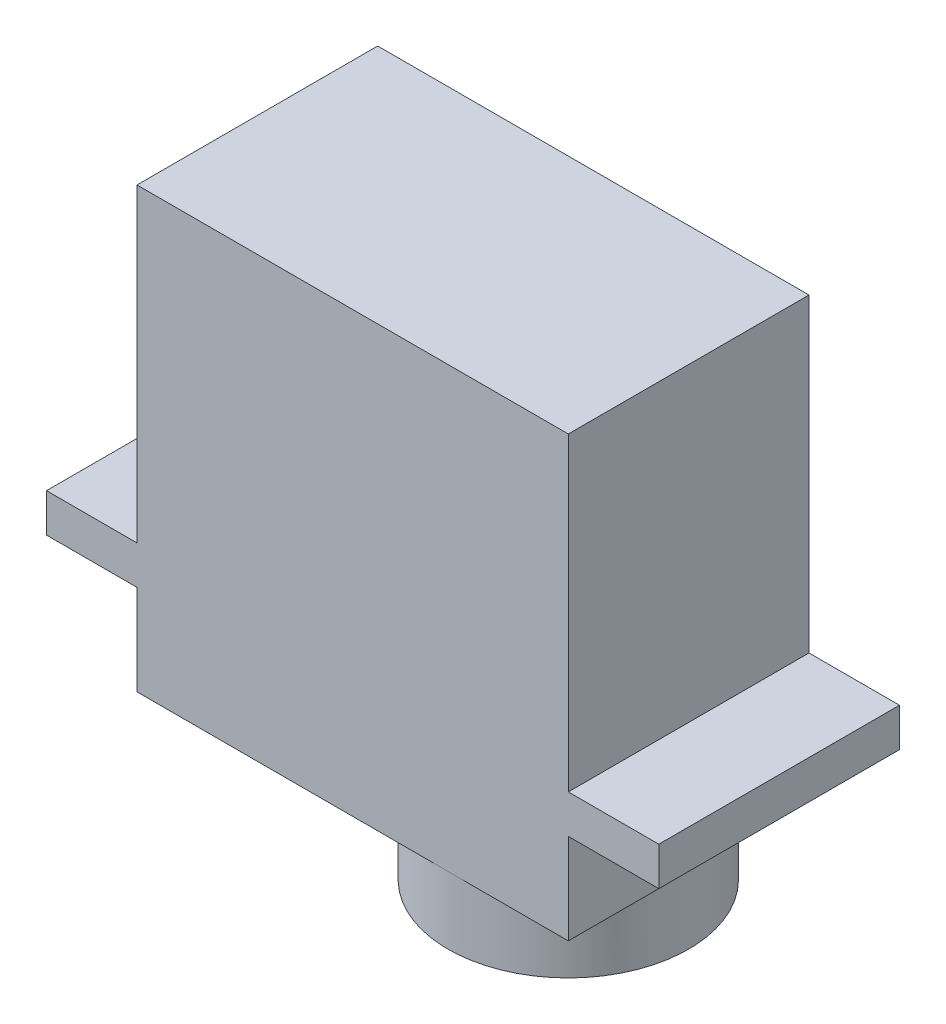
ISO-10303-21;
HEADER;
FILE_DESCRIPTION(('STEP AP214'),'2;1');
FILE_NAME('part.step','',(''),(''),'','','');
FILE_SCHEMA(('AUTOMOTIVE_DESIGN { 1 0 10303 214 1 1 1 1 }'));
ENDSEC;
DATA;
#1=APPLICATION_CONTEXT('core data for automotive mechanical design processes');
#2=APPLICATION_PROTOCOL_DEFINITION('international standard','automotive_design',2000,#1);
#3=PRODUCT_CONTEXT('',#1,'mechanical');
#4=PRODUCT('Part','Part','',(#3));
#5=PRODUCT_RELATED_PRODUCT_CATEGORY('part','',(#4));
#6=PRODUCT_DEFINITION_FORMATION('','',#4);
#7=PRODUCT_DEFINITION_CONTEXT('part definition',#1,'design');
#8=PRODUCT_DEFINITION('design','',#6,#7);
#9=PRODUCT_DEFINITION_SHAPE('','',#8);
#10=(LENGTH_UNIT() NAMED_UNIT(*) SI_UNIT(.MILLI.,.METRE.));
#11=(NAMED_UNIT(*) PLANE_ANGLE_UNIT() SI_UNIT($,.RADIAN.));
#12=(NAMED_UNIT(*) SI_UNIT($,.STERADIAN.) SOLID_ANGLE_UNIT());
#13=UNCERTAINTY_MEASURE_WITH_UNIT(LENGTH_MEASURE(1.E-05),#10,'distance_accuracy_value','');
#14=(GEOMETRIC_REPRESENTATION_CONTEXT(3) GLOBAL_UNCERTAINTY_ASSIGNED_CONTEXT((#13)) GLOBAL_UNIT_ASSIGNED_CONTEXT((#10,
#11,#12)) REPRESENTATION_CONTEXT('',''));
#15=CARTESIAN_POINT('',(0.,0.,0.));
#16=DIRECTION('',(0.,0.,1.));
#17=DIRECTION('',(1.,0.,0.));
#18=AXIS2_PLACEMENT_3D('',#15,#16,#17);
#19=CARTESIAN_POINT('',(0.,0.,0.));
#20=DIRECTION('',(0.,1.,0.));
#21=DIRECTION('',(0.,0.,1.));
#22=AXIS2_PLACEMENT_3D('',#19,#20,#21);
#23=PLANE('',#22);
#24=CARTESIAN_POINT('',(-1.69999999999999,0.,0.));
#25=DIRECTION('',(0.,-1.,0.));
#26=DIRECTION('',(0.,0.,-1.));
#27=AXIS2_PLACEMENT_3D('',#24,#25,#26);
#28=CIRCLE('',#27,2.5);
#29=CARTESIAN_POINT('',(-0.84210526315789,0.,2.34819433192797));
#30=VERTEX_POINT('',#29);
#31=CARTESIAN_POINT('',(-0.842105263157892,0.,-2.34819433192796));
#32=VERTEX_POINT('',#31);
#33=EDGE_CURVE('E160',#30,#32,#28,.T.);
#34=ORIENTED_EDGE('',*,*,#33,.F.);
#35=CARTESIAN_POINT('',(4.95,0.,0.));
#36=DIRECTION('',(0.,-1.,0.));
#37=DIRECTION('',(0.,0.,-1.));
#38=AXIS2_PLACEMENT_3D('',#35,#36,#37);
#39=CIRCLE('',#38,6.25);
#40=CARTESIAN_POINT('',(4.95,0.,6.25));
#41=VERTEX_POINT('',#40);
#42=EDGE_CURVE('E263',#41,#30,#39,.T.);
#43=ORIENTED_EDGE('',*,*,#42,.F.);
#44=DIRECTION('',(1.,0.,0.));
#45=VECTOR('',#44,1.);
#46=CARTESIAN_POINT('',(-11.2,0.,6.25));
#47=LINE('',#46,#45);
#48=CARTESIAN_POINT('',(-11.2,0.,6.25));
#49=VERTEX_POINT('',#48);
#50=EDGE_CURVE('E223',#49,#41,#47,.T.);
#51=ORIENTED_EDGE('',*,*,#50,.F.);
#52=DIRECTION('',(0.,0.,1.));
#53=VECTOR('',#52,1.);
#54=CARTESIAN_POINT('',(-11.2,0.,-6.25));
#55=LINE('',#54,#53);
#56=CARTESIAN_POINT('',(-11.2,0.,-6.25));
#57=VERTEX_POINT('',#56);
#58=EDGE_CURVE('E237',#57,#49,#55,.T.);
#59=ORIENTED_EDGE('',*,*,#58,.F.);
#60=DIRECTION('',(-1.,0.,0.));
#61=VECTOR('',#60,1.);
#62=CARTESIAN_POINT('',(-11.2,0.,-6.25));
#63=LINE('',#62,#61);
#64=CARTESIAN_POINT('',(4.95,0.,-6.25));
#65=VERTEX_POINT('',#64);
#66=EDGE_CURVE('E233',#65,#57,#63,.T.);
#67=ORIENTED_EDGE('',*,*,#66,.F.);
#68=EDGE_CURVE('E43',#32,#65,#39,.T.);
#69=ORIENTED_EDGE('',*,*,#68,.F.);
#70=EDGE_LOOP('',(#34,#43,#51,#59,#67,#69));
#71=FACE_BOUND('',#70,.T.);
#72=ADVANCED_FACE('F32',(#71),#23,.F.);
#73=CARTESIAN_POINT('',(11.2,0.,0.));
#74=VERTEX_POINT('',#73);
#75=EDGE_CURVE('E11',#65,#74,#39,.T.);
#76=ORIENTED_EDGE('',*,*,#75,.F.);
#77=CARTESIAN_POINT('',(11.2,0.,-6.25));
#78=VERTEX_POINT('',#77);
#79=EDGE_CURVE('E234',#78,#65,#63,.T.);
#80=ORIENTED_EDGE('',*,*,#79,.F.);
#81=DIRECTION('',(0.,0.,-1.));
#82=VECTOR('',#81,1.);
#83=CARTESIAN_POINT('',(11.2,0.,-6.25));
#84=LINE('',#83,#82);
#85=EDGE_CURVE('E218',#74,#78,#84,.T.);
#86=ORIENTED_EDGE('',*,*,#85,.F.);
#87=EDGE_LOOP('',(#76,#80,#86));
#88=FACE_BOUND('',#87,.T.);
#89=ADVANCED_FACE('F296',(#88),#23,.F.);
#90=CARTESIAN_POINT('',(-11.2,22.8,-6.25));
#91=DIRECTION('',(1.,0.,0.));
#92=DIRECTION('',(0.,0.,-1.));
#93=AXIS2_PLACEMENT_3D('',#90,#91,#92);
#94=PLANE('',#93);
#95=DIRECTION('',(0.,0.,-1.));
#96=VECTOR('',#95,1.);
#97=CARTESIAN_POINT('',(-11.2,6.7,-6.25));
#98=LINE('',#97,#96);
#99=CARTESIAN_POINT('',(-11.2,6.7,6.25));
#100=VERTEX_POINT('',#99);
#101=CARTESIAN_POINT('',(-11.2,6.7,-6.25));
#102=VERTEX_POINT('',#101);
#103=EDGE_CURVE('E164',#100,#102,#98,.T.);
#104=ORIENTED_EDGE('',*,*,#103,.F.);
#105=DIRECTION('',(0.,-1.,0.));
#106=VECTOR('',#105,1.);
#107=CARTESIAN_POINT('',(-11.2,22.8,6.25));
#108=LINE('',#107,#106);
#109=CARTESIAN_POINT('',(-11.2,22.8,6.25));
#110=VERTEX_POINT('',#109);
#111=EDGE_CURVE('E246',#110,#100,#108,.T.);
#112=ORIENTED_EDGE('',*,*,#111,.F.);
#113=DIRECTION('',(0.,0.,1.));
#114=VECTOR('',#113,1.);
#115=CARTESIAN_POINT('',(-11.2,22.8,-6.25));
#116=LINE('',#115,#114);
#117=CARTESIAN_POINT('',(-11.2,22.8,-6.25));
#118=VERTEX_POINT('',#117);
#119=EDGE_CURVE('E225',#118,#110,#116,.T.);
#120=ORIENTED_EDGE('',*,*,#119,.F.);
#121=DIRECTION('',(0.,-1.,0.));
#122=VECTOR('',#121,1.);
#123=CARTESIAN_POINT('',(-11.2,22.8,-6.25));
#124=LINE('',#123,#122);
#125=EDGE_CURVE('E249',#118,#102,#124,.T.);
#126=ORIENTED_EDGE('',*,*,#125,.T.);
#127=EDGE_LOOP('',(#104,#112,#120,#126));
#128=FACE_BOUND('',#127,.T.);
#129=ADVANCED_FACE('F302',(#128),#94,.F.);
#130=DIRECTION('',(0.,0.,1.));
#131=VECTOR('',#130,1.);
#132=CARTESIAN_POINT('',(-11.2,4.7,-6.25));
#133=LINE('',#132,#131);
#134=CARTESIAN_POINT('',(-11.2,4.7,-6.25));
#135=VERTEX_POINT('',#134);
#136=CARTESIAN_POINT('',(-11.2,4.7,6.25));
#137=VERTEX_POINT('',#136);
#138=EDGE_CURVE('E161',#135,#137,#133,.T.);
#139=ORIENTED_EDGE('',*,*,#138,.F.);
#140=EDGE_CURVE('E248',#135,#57,#124,.T.);
#141=ORIENTED_EDGE('',*,*,#140,.T.);
#142=ORIENTED_EDGE('',*,*,#58,.T.);
#143=EDGE_CURVE('E245',#137,#49,#108,.T.);
#144=ORIENTED_EDGE('',*,*,#143,.F.);
#145=EDGE_LOOP('',(#139,#141,#142,#144));
#146=FACE_BOUND('',#145,.T.);
#147=ADVANCED_FACE('F259',(#146),#94,.F.);
#148=CARTESIAN_POINT('',(11.2,22.8,-6.25));
#149=DIRECTION('',(-1.,0.,0.));
#150=DIRECTION('',(0.,0.,1.));
#151=AXIS2_PLACEMENT_3D('',#148,#149,#150);
#152=PLANE('',#151);
#153=DIRECTION('',(0.,0.,1.));
#154=VECTOR('',#153,1.);
#155=CARTESIAN_POINT('',(11.2,6.7,6.25));
#156=LINE('',#155,#154);
#157=CARTESIAN_POINT('',(11.2,6.7,-6.25));
#158=VERTEX_POINT('',#157);
#159=CARTESIAN_POINT('',(11.2,6.7,6.25));
#160=VERTEX_POINT('',#159);
#161=EDGE_CURVE('E196',#158,#160,#156,.T.);
#162=ORIENTED_EDGE('',*,*,#161,.F.);
#163=DIRECTION('',(0.,-1.,0.));
#164=VECTOR('',#163,1.);
#165=CARTESIAN_POINT('',(11.2,22.8,-6.25));
#166=LINE('',#165,#164);
#167=CARTESIAN_POINT('',(11.2,22.8,-6.25));
#168=VERTEX_POINT('',#167);
#169=EDGE_CURVE('E36',#168,#158,#166,.T.);
#170=ORIENTED_EDGE('',*,*,#169,.F.);
#171=DIRECTION('',(0.,0.,-1.));
#172=VECTOR('',#171,1.);
#173=CARTESIAN_POINT('',(11.2,22.8,-6.25));
#174=LINE('',#173,#172);
#175=CARTESIAN_POINT('',(11.2,22.8,6.25));
#176=VERTEX_POINT('',#175);
#177=EDGE_CURVE('E219',#176,#168,#174,.T.);
#178=ORIENTED_EDGE('',*,*,#177,.F.);
#179=DIRECTION('',(0.,-1.,0.));
#180=VECTOR('',#179,1.);
#181=CARTESIAN_POINT('',(11.2,22.8,6.25));
#182=LINE('',#181,#180);
#183=EDGE_CURVE('E243',#176,#160,#182,.T.);
#184=ORIENTED_EDGE('',*,*,#183,.T.);
#185=EDGE_LOOP('',(#162,#170,#178,#184));
#186=FACE_BOUND('',#185,.T.);
#187=ADVANCED_FACE('F34',(#186),#152,.F.);
#188=DIRECTION('',(0.,0.,-1.));
#189=VECTOR('',#188,1.);
#190=CARTESIAN_POINT('',(11.2,4.7,6.25));
#191=LINE('',#190,#189);
#192=CARTESIAN_POINT('',(11.2,4.7,6.25));
#193=VERTEX_POINT('',#192);
#194=CARTESIAN_POINT('',(11.2,4.7,-6.25));
#195=VERTEX_POINT('',#194);
#196=EDGE_CURVE('E191',#193,#195,#191,.T.);
#197=ORIENTED_EDGE('',*,*,#196,.F.);
#198=CARTESIAN_POINT('',(11.2,0.,6.25));
#199=VERTEX_POINT('',#198);
#200=EDGE_CURVE('E229',#193,#199,#182,.T.);
#201=ORIENTED_EDGE('',*,*,#200,.T.);
#202=EDGE_CURVE('E230',#199,#74,#84,.T.);
#203=ORIENTED_EDGE('',*,*,#202,.T.);
#204=ORIENTED_EDGE('',*,*,#85,.T.);
#205=EDGE_CURVE('E250',#195,#78,#166,.T.);
#206=ORIENTED_EDGE('',*,*,#205,.F.);
#207=EDGE_LOOP('',(#197,#201,#203,#204,#206));
#208=FACE_BOUND('',#207,.T.);
#209=ADVANCED_FACE('F415',(#208),#152,.F.);
#210=CARTESIAN_POINT('',(-11.2,22.8,-6.25));
#211=DIRECTION('',(0.,0.,1.));
#212=DIRECTION('',(1.,0.,0.));
#213=AXIS2_PLACEMENT_3D('',#210,#211,#212);
#214=PLANE('',#213);
#215=ORIENTED_EDGE('',*,*,#79,.T.);
#216=ORIENTED_EDGE('',*,*,#66,.T.);
#217=ORIENTED_EDGE('',*,*,#140,.F.);
#218=DIRECTION('',(1.,0.,0.));
#219=VECTOR('',#218,1.);
#220=CARTESIAN_POINT('',(-15.9,4.7,-6.25));
#221=LINE('',#220,#219);
#222=CARTESIAN_POINT('',(-15.9,4.7,-6.25));
#223=VERTEX_POINT('',#222);
#224=EDGE_CURVE('E188',#223,#135,#221,.T.);
#225=ORIENTED_EDGE('',*,*,#224,.F.);
#226=DIRECTION('',(0.,-1.,0.));
#227=VECTOR('',#226,1.);
#228=CARTESIAN_POINT('',(-15.9,6.7,-6.25));
#229=LINE('',#228,#227);
#230=CARTESIAN_POINT('',(-15.9,6.7,-6.25));
#231=VERTEX_POINT('',#230);
#232=EDGE_CURVE('E168',#231,#223,#229,.T.);
#233=ORIENTED_EDGE('',*,*,#232,.F.);
#234=DIRECTION('',(1.,0.,0.));
#235=VECTOR('',#234,1.);
#236=CARTESIAN_POINT('',(-15.9,6.7,-6.25));
#237=LINE('',#236,#235);
#238=EDGE_CURVE('E176',#231,#102,#237,.T.);
#239=ORIENTED_EDGE('',*,*,#238,.T.);
#240=ORIENTED_EDGE('',*,*,#125,.F.);
#241=DIRECTION('',(-1.,0.,0.));
#242=VECTOR('',#241,1.);
#243=CARTESIAN_POINT('',(-11.2,22.8,-6.25));
#244=LINE('',#243,#242);
#245=EDGE_CURVE('E222',#168,#118,#244,.T.);
#246=ORIENTED_EDGE('',*,*,#245,.F.);
#247=ORIENTED_EDGE('',*,*,#169,.T.);
#248=DIRECTION('',(-1.,0.,0.));
#249=VECTOR('',#248,1.);
#250=CARTESIAN_POINT('',(15.9,6.7,-6.25));
#251=LINE('',#250,#249);
#252=CARTESIAN_POINT('',(15.9,6.7,-6.25));
#253=VERTEX_POINT('',#252);
#254=EDGE_CURVE('E209',#253,#158,#251,.T.);
#255=ORIENTED_EDGE('',*,*,#254,.F.);
#256=DIRECTION('',(0.,1.,0.));
#257=VECTOR('',#256,1.);
#258=CARTESIAN_POINT('',(15.9,6.7,-6.25));
#259=LINE('',#258,#257);
#260=CARTESIAN_POINT('',(15.9,4.7,-6.25));
#261=VERTEX_POINT('',#260);
#262=EDGE_CURVE('E198',#261,#253,#259,.T.);
#263=ORIENTED_EDGE('',*,*,#262,.F.);
#264=DIRECTION('',(-1.,0.,0.));
#265=VECTOR('',#264,1.);
#266=CARTESIAN_POINT('',(15.9,4.7,-6.25));
#267=LINE('',#266,#265);
#268=EDGE_CURVE('E212',#261,#195,#267,.T.);
#269=ORIENTED_EDGE('',*,*,#268,.T.);
#270=ORIENTED_EDGE('',*,*,#205,.T.);
#271=EDGE_LOOP('',(#215,#216,#217,#225,#233,#239,#240,#246,#247,#255,#263,#269,#270));
#272=FACE_BOUND('',#271,.T.);
#273=ADVANCED_FACE('F319',(#272),#214,.F.);
#274=CARTESIAN_POINT('',(-11.2,22.8,6.25));
#275=DIRECTION('',(0.,0.,-1.));
#276=DIRECTION('',(-1.,0.,0.));
#277=AXIS2_PLACEMENT_3D('',#274,#275,#276);
#278=PLANE('',#277);
#279=ORIENTED_EDGE('',*,*,#50,.T.);
#280=EDGE_CURVE('E240',#41,#199,#47,.T.);
#281=ORIENTED_EDGE('',*,*,#280,.T.);
#282=ORIENTED_EDGE('',*,*,#200,.F.);
#283=DIRECTION('',(-1.,0.,0.));
#284=VECTOR('',#283,1.);
#285=CARTESIAN_POINT('',(15.9,4.7,6.25));
#286=LINE('',#285,#284);
#287=CARTESIAN_POINT('',(15.9,4.7,6.25));
#288=VERTEX_POINT('',#287);
#289=EDGE_CURVE('E215',#288,#193,#286,.T.);
#290=ORIENTED_EDGE('',*,*,#289,.F.);
#291=DIRECTION('',(0.,-1.,0.));
#292=VECTOR('',#291,1.);
#293=CARTESIAN_POINT('',(15.9,6.7,6.25));
#294=LINE('',#293,#292);
#295=CARTESIAN_POINT('',(15.9,6.7,6.25));
#296=VERTEX_POINT('',#295);
#297=EDGE_CURVE('E192',#296,#288,#294,.T.);
#298=ORIENTED_EDGE('',*,*,#297,.F.);
#299=DIRECTION('',(-1.,0.,0.));
#300=VECTOR('',#299,1.);
#301=CARTESIAN_POINT('',(15.9,6.7,6.25));
#302=LINE('',#301,#300);
#303=EDGE_CURVE('E202',#296,#160,#302,.T.);
#304=ORIENTED_EDGE('',*,*,#303,.T.);
#305=ORIENTED_EDGE('',*,*,#183,.F.);
#306=DIRECTION('',(1.,0.,0.));
#307=VECTOR('',#306,1.);
#308=CARTESIAN_POINT('',(-11.2,22.8,6.25));
#309=LINE('',#308,#307);
#310=EDGE_CURVE('E227',#110,#176,#309,.T.);
#311=ORIENTED_EDGE('',*,*,#310,.F.);
#312=ORIENTED_EDGE('',*,*,#111,.T.);
#313=DIRECTION('',(1.,0.,0.));
#314=VECTOR('',#313,1.);
#315=CARTESIAN_POINT('',(-15.9,6.7,6.25));
#316=LINE('',#315,#314);
#317=CARTESIAN_POINT('',(-15.9,6.7,6.25));
#318=VERTEX_POINT('',#317);
#319=EDGE_CURVE('E182',#318,#100,#316,.T.);
#320=ORIENTED_EDGE('',*,*,#319,.F.);
#321=DIRECTION('',(0.,1.,0.));
#322=VECTOR('',#321,1.);
#323=CARTESIAN_POINT('',(-15.9,6.7,6.25));
#324=LINE('',#323,#322);
#325=CARTESIAN_POINT('',(-15.9,4.7,6.25));
#326=VERTEX_POINT('',#325);
#327=EDGE_CURVE('E173',#326,#318,#324,.T.);
#328=ORIENTED_EDGE('',*,*,#327,.F.);
#329=DIRECTION('',(1.,0.,0.));
#330=VECTOR('',#329,1.);
#331=CARTESIAN_POINT('',(-15.9,4.7,6.25));
#332=LINE('',#331,#330);
#333=EDGE_CURVE('E185',#326,#137,#332,.T.);
#334=ORIENTED_EDGE('',*,*,#333,.T.);
#335=ORIENTED_EDGE('',*,*,#143,.T.);
#336=EDGE_LOOP('',(#279,#281,#282,#290,#298,#304,#305,#311,#312,#320,#328,#334,#335));
#337=FACE_BOUND('',#336,.T.);
#338=ADVANCED_FACE('F267',(#337),#278,.F.);
#339=CARTESIAN_POINT('',(0.,22.8,0.));
#340=DIRECTION('',(0.,1.,0.));
#341=DIRECTION('',(0.,0.,1.));
#342=AXIS2_PLACEMENT_3D('',#339,#340,#341);
#343=PLANE('',#342);
#344=ORIENTED_EDGE('',*,*,#177,.T.);
#345=ORIENTED_EDGE('',*,*,#245,.T.);
#346=ORIENTED_EDGE('',*,*,#119,.T.);
#347=ORIENTED_EDGE('',*,*,#310,.T.);
#348=EDGE_LOOP('',(#344,#345,#346,#347));
#349=FACE_BOUND('',#348,.T.);
#350=ADVANCED_FACE('F307',(#349),#343,.T.);
#351=EDGE_CURVE('E41',#74,#41,#39,.T.);
#352=ORIENTED_EDGE('',*,*,#351,.F.);
#353=ORIENTED_EDGE('',*,*,#202,.F.);
#354=ORIENTED_EDGE('',*,*,#280,.F.);
#355=EDGE_LOOP('',(#352,#353,#354));
#356=FACE_BOUND('',#355,.T.);
#357=ADVANCED_FACE('F298',(#356),#23,.F.);
#358=CARTESIAN_POINT('',(15.9,4.7,6.25));
#359=DIRECTION('',(0.,1.,0.));
#360=DIRECTION('',(0.,0.,1.));
#361=AXIS2_PLACEMENT_3D('',#358,#359,#360);
#362=PLANE('',#361);
#363=ORIENTED_EDGE('',*,*,#196,.T.);
#364=ORIENTED_EDGE('',*,*,#268,.F.);
#365=DIRECTION('',(0.,0.,-1.));
#366=VECTOR('',#365,1.);
#367=CARTESIAN_POINT('',(15.9,4.7,6.25));
#368=LINE('',#367,#366);
#369=EDGE_CURVE('E195',#288,#261,#368,.T.);
#370=ORIENTED_EDGE('',*,*,#369,.F.);
#371=ORIENTED_EDGE('',*,*,#289,.T.);
#372=EDGE_LOOP('',(#363,#364,#370,#371));
#373=FACE_BOUND('',#372,.T.);
#374=ADVANCED_FACE('F306',(#373),#362,.F.);
#375=CARTESIAN_POINT('',(15.9,6.7,6.25));
#376=DIRECTION('',(0.,-1.,0.));
#377=DIRECTION('',(0.,0.,-1.));
#378=AXIS2_PLACEMENT_3D('',#375,#376,#377);
#379=PLANE('',#378);
#380=ORIENTED_EDGE('',*,*,#161,.T.);
#381=ORIENTED_EDGE('',*,*,#303,.F.);
#382=DIRECTION('',(0.,0.,1.));
#383=VECTOR('',#382,1.);
#384=CARTESIAN_POINT('',(15.9,6.7,6.25));
#385=LINE('',#384,#383);
#386=EDGE_CURVE('E200',#253,#296,#385,.T.);
#387=ORIENTED_EDGE('',*,*,#386,.F.);
#388=ORIENTED_EDGE('',*,*,#254,.T.);
#389=EDGE_LOOP('',(#380,#381,#387,#388));
#390=FACE_BOUND('',#389,.T.);
#391=ADVANCED_FACE('F312',(#390),#379,.F.);
#392=CARTESIAN_POINT('',(15.9,0.,0.));
#393=DIRECTION('',(1.,0.,0.));
#394=DIRECTION('',(0.,0.,-1.));
#395=AXIS2_PLACEMENT_3D('',#392,#393,#394);
#396=PLANE('',#395);
#397=ORIENTED_EDGE('',*,*,#297,.T.);
#398=ORIENTED_EDGE('',*,*,#369,.T.);
#399=ORIENTED_EDGE('',*,*,#262,.T.);
#400=ORIENTED_EDGE('',*,*,#386,.T.);
#401=EDGE_LOOP('',(#397,#398,#399,#400));
#402=FACE_BOUND('',#401,.T.);
#403=ADVANCED_FACE('F323',(#402),#396,.T.);
#404=CARTESIAN_POINT('',(-15.9,4.7,-6.25));
#405=DIRECTION('',(0.,1.,0.));
#406=DIRECTION('',(0.,0.,1.));
#407=AXIS2_PLACEMENT_3D('',#404,#405,#406);
#408=PLANE('',#407);
#409=ORIENTED_EDGE('',*,*,#138,.T.);
#410=ORIENTED_EDGE('',*,*,#333,.F.);
#411=DIRECTION('',(0.,0.,1.));
#412=VECTOR('',#411,1.);
#413=CARTESIAN_POINT('',(-15.9,4.7,-6.25));
#414=LINE('',#413,#412);
#415=EDGE_CURVE('E171',#223,#326,#414,.T.);
#416=ORIENTED_EDGE('',*,*,#415,.F.);
#417=ORIENTED_EDGE('',*,*,#224,.T.);
#418=EDGE_LOOP('',(#409,#410,#416,#417));
#419=FACE_BOUND('',#418,.T.);
#420=ADVANCED_FACE('F327',(#419),#408,.F.);
#421=CARTESIAN_POINT('',(-15.9,6.7,-6.25));
#422=DIRECTION('',(0.,-1.,0.));
#423=DIRECTION('',(0.,0.,-1.));
#424=AXIS2_PLACEMENT_3D('',#421,#422,#423);
#425=PLANE('',#424);
#426=ORIENTED_EDGE('',*,*,#103,.T.);
#427=ORIENTED_EDGE('',*,*,#238,.F.);
#428=DIRECTION('',(0.,0.,-1.));
#429=VECTOR('',#428,1.);
#430=CARTESIAN_POINT('',(-15.9,6.7,-6.25));
#431=LINE('',#430,#429);
#432=EDGE_CURVE('E175',#318,#231,#431,.T.);
#433=ORIENTED_EDGE('',*,*,#432,.F.);
#434=ORIENTED_EDGE('',*,*,#319,.T.);
#435=EDGE_LOOP('',(#426,#427,#433,#434));
#436=FACE_BOUND('',#435,.T.);
#437=ADVANCED_FACE('F331',(#436),#425,.F.);
#438=CARTESIAN_POINT('',(-15.9,0.,0.));
#439=DIRECTION('',(-1.,0.,0.));
#440=DIRECTION('',(0.,0.,1.));
#441=AXIS2_PLACEMENT_3D('',#438,#439,#440);
#442=PLANE('',#441);
#443=ORIENTED_EDGE('',*,*,#232,.T.);
#444=ORIENTED_EDGE('',*,*,#415,.T.);
#445=ORIENTED_EDGE('',*,*,#327,.T.);
#446=ORIENTED_EDGE('',*,*,#432,.T.);
#447=EDGE_LOOP('',(#443,#444,#445,#446));
#448=FACE_BOUND('',#447,.T.);
#449=ADVANCED_FACE('F335',(#448),#442,.T.);
#450=CARTESIAN_POINT('',(-1.69999999999999,-3.5,0.));
#451=DIRECTION('',(0.,1.,0.));
#452=DIRECTION('',(0.,0.,1.));
#453=AXIS2_PLACEMENT_3D('',#450,#451,#452);
#454=CYLINDRICAL_SURFACE('',#453,2.5);
#455=ORIENTED_EDGE('',*,*,#33,.T.);
#456=DIRECTION('',(0.,1.,0.));
#457=VECTOR('',#456,1.);
#458=CARTESIAN_POINT('',(-0.842105263157892,-3.5,-2.34819433192796));
#459=LINE('',#458,#457);
#460=CARTESIAN_POINT('',(-0.842105263157892,-3.5,-2.34819433192796));
#461=VERTEX_POINT('',#460);
#462=EDGE_CURVE('E147',#461,#32,#459,.T.);
#463=ORIENTED_EDGE('',*,*,#462,.F.);
#464=CARTESIAN_POINT('',(-1.69999999999999,-3.5,0.));
#465=DIRECTION('',(0.,-1.,0.));
#466=DIRECTION('',(0.,0.,-1.));
#467=AXIS2_PLACEMENT_3D('',#464,#465,#466);
#468=CIRCLE('',#467,2.5);
#469=CARTESIAN_POINT('',(-0.84210526315789,-3.5,2.34819433192797));
#470=VERTEX_POINT('',#469);
#471=EDGE_CURVE('E154',#470,#461,#468,.T.);
#472=ORIENTED_EDGE('',*,*,#471,.F.);
#473=DIRECTION('',(0.,1.,0.));
#474=VECTOR('',#473,1.);
#475=CARTESIAN_POINT('',(-0.84210526315789,-3.5,2.34819433192797));
#476=LINE('',#475,#474);
#477=EDGE_CURVE('E151',#470,#30,#476,.T.);
#478=ORIENTED_EDGE('',*,*,#477,.T.);
#479=EDGE_LOOP('',(#455,#463,#472,#478));
#480=FACE_BOUND('',#479,.T.);
#481=ADVANCED_FACE('F159',(#480),#454,.T.);
#482=CARTESIAN_POINT('',(4.95,-3.5,0.));
#483=DIRECTION('',(0.,1.,0.));
#484=DIRECTION('',(0.,0.,1.));
#485=AXIS2_PLACEMENT_3D('',#482,#483,#484);
#486=CYLINDRICAL_SURFACE('',#485,6.25);
#487=ORIENTED_EDGE('',*,*,#68,.T.);
#488=ORIENTED_EDGE('',*,*,#75,.T.);
#489=ORIENTED_EDGE('',*,*,#351,.T.);
#490=ORIENTED_EDGE('',*,*,#42,.T.);
#491=ORIENTED_EDGE('',*,*,#477,.F.);
#492=CARTESIAN_POINT('',(4.95,-3.5,0.));
#493=DIRECTION('',(0.,-1.,0.));
#494=DIRECTION('',(0.,0.,-1.));
#495=AXIS2_PLACEMENT_3D('',#492,#493,#494);
#496=CIRCLE('',#495,6.25);
#497=EDGE_CURVE('E143',#461,#470,#496,.T.);
#498=ORIENTED_EDGE('',*,*,#497,.F.);
#499=ORIENTED_EDGE('',*,*,#462,.T.);
#500=EDGE_LOOP('',(#487,#488,#489,#490,#491,#498,#499));
#501=FACE_BOUND('',#500,.T.);
#502=ADVANCED_FACE('F145',(#501),#486,.T.);
#503=CARTESIAN_POINT('',(1.625,-3.5,0.));
#504=DIRECTION('',(0.,-1.,0.));
#505=DIRECTION('',(0.,0.,-1.));
#506=AXIS2_PLACEMENT_3D('',#503,#504,#505);
#507=PLANE('',#506);
#508=CARTESIAN_POINT('',(4.95,-3.5,0.));
#509=DIRECTION('',(0.,-1.,0.));
#510=DIRECTION('',(0.,0.,-1.));
#511=AXIS2_PLACEMENT_3D('',#508,#509,#510);
#512=CIRCLE('',#511,2.5);
#513=CARTESIAN_POINT('',(4.95,-3.5,-2.5));
#514=VERTEX_POINT('',#513);
#515=EDGE_CURVE('E275',#514,#514,#512,.T.);
#516=ORIENTED_EDGE('',*,*,#515,.F.);
#517=EDGE_LOOP('',(#516));
#518=FACE_BOUND('',#517,.T.);
#519=ORIENTED_EDGE('',*,*,#471,.T.);
#520=ORIENTED_EDGE('',*,*,#497,.T.);
#521=EDGE_LOOP('',(#519,#520));
#522=FACE_BOUND('',#521,.T.);
#523=ADVANCED_FACE('F156',(#518,#522),#507,.T.);
#524=CARTESIAN_POINT('',(4.95,1.5,0.));
#525=DIRECTION('',(0.,-1.,0.));
#526=DIRECTION('',(0.,0.,-1.));
#527=AXIS2_PLACEMENT_3D('',#524,#525,#526);
#528=CYLINDRICAL_SURFACE('',#527,2.5);
#529=CARTESIAN_POINT('',(4.95,1.5,0.));
#530=DIRECTION('',(0.,-1.,0.));
#531=DIRECTION('',(0.,0.,-1.));
#532=AXIS2_PLACEMENT_3D('',#529,#530,#531);
#533=CIRCLE('',#532,2.5);
#534=CARTESIAN_POINT('',(4.95,1.5,-2.5));
#535=VERTEX_POINT('',#534);
#536=EDGE_CURVE('E273',#535,#535,#533,.T.);
#537=ORIENTED_EDGE('',*,*,#536,.F.);
#538=EDGE_LOOP('',(#537));
#539=FACE_BOUND('',#538,.T.);
#540=ORIENTED_EDGE('',*,*,#515,.T.);
#541=EDGE_LOOP('',(#540));
#542=FACE_BOUND('',#541,.T.);
#543=ADVANCED_FACE('F283',(#539,#542),#528,.F.);
#544=CARTESIAN_POINT('',(4.95,1.5,0.));
#545=DIRECTION('',(0.,-1.,0.));
#546=DIRECTION('',(0.,0.,-1.));
#547=AXIS2_PLACEMENT_3D('',#544,#545,#546);
#548=PLANE('',#547);
#549=ORIENTED_EDGE('',*,*,#536,.T.);
#550=EDGE_LOOP('',(#549));
#551=FACE_BOUND('',#550,.T.);
#552=ADVANCED_FACE('F281',(#551),#548,.T.);
#553=CLOSED_SHELL('',(#72,#89,#129,#147,#187,#209,#273,#338,#350,#357,#374,#391,#403,#420,#437,
#449,#481,#502,#523,#543,#552));
#554=MANIFOLD_SOLID_BREP('B2',#553);
#555=ADVANCED_BREP_SHAPE_REPRESENTATION('',(#18,#554),#14);
#556=SHAPE_DEFINITION_REPRESENTATION(#9,#555);
ENDSEC;
END-ISO-10303-21;
